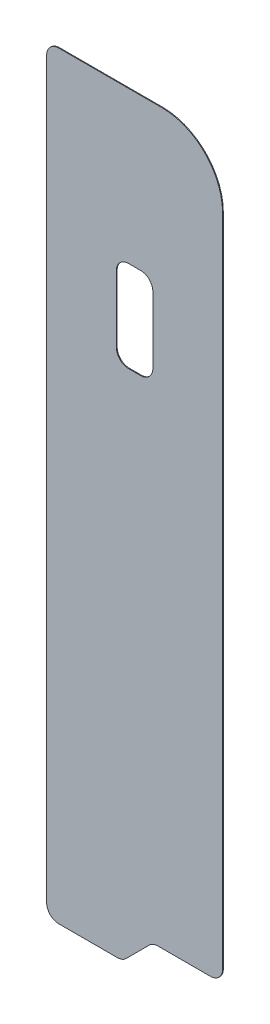
ISO-10303-21;
HEADER;
FILE_DESCRIPTION(('STEP AP214'),'2;1');
FILE_NAME('part.step','',(''),(''),'','','');
FILE_SCHEMA(('AUTOMOTIVE_DESIGN { 1 0 10303 214 1 1 1 1 }'));
ENDSEC;
DATA;
#1=APPLICATION_CONTEXT('core data for automotive mechanical design processes');
#2=APPLICATION_PROTOCOL_DEFINITION('international standard','automotive_design',2000,#1);
#3=PRODUCT_CONTEXT('',#1,'mechanical');
#4=PRODUCT('Part','Part','',(#3));
#5=PRODUCT_RELATED_PRODUCT_CATEGORY('part','',(#4));
#6=PRODUCT_DEFINITION_FORMATION('','',#4);
#7=PRODUCT_DEFINITION_CONTEXT('part definition',#1,'design');
#8=PRODUCT_DEFINITION('design','',#6,#7);
#9=PRODUCT_DEFINITION_SHAPE('','',#8);
#10=(LENGTH_UNIT() NAMED_UNIT(*) SI_UNIT(.MILLI.,.METRE.));
#11=(NAMED_UNIT(*) PLANE_ANGLE_UNIT() SI_UNIT($,.RADIAN.));
#12=(NAMED_UNIT(*) SI_UNIT($,.STERADIAN.) SOLID_ANGLE_UNIT());
#13=UNCERTAINTY_MEASURE_WITH_UNIT(LENGTH_MEASURE(1.E-05),#10,'distance_accuracy_value','');
#14=(GEOMETRIC_REPRESENTATION_CONTEXT(3) GLOBAL_UNCERTAINTY_ASSIGNED_CONTEXT((#13)) GLOBAL_UNIT_ASSIGNED_CONTEXT((#10,
#11,#12)) REPRESENTATION_CONTEXT('',''));
#15=CARTESIAN_POINT('',(0.,0.,0.));
#16=DIRECTION('',(0.,0.,1.));
#17=DIRECTION('',(1.,0.,0.));
#18=AXIS2_PLACEMENT_3D('',#15,#16,#17);
#19=CARTESIAN_POINT('',(-12.5,-60.,0.125));
#20=DIRECTION('',(0.,1.,0.));
#21=DIRECTION('',(-1.,0.,0.));
#22=AXIS2_PLACEMENT_3D('',#19,#20,#21);
#23=PLANE('',#22);
#24=DIRECTION('',(0.,0.,-1.));
#25=VECTOR('',#24,1.);
#26=CARTESIAN_POINT('',(3.82842712474628,-60.,28.0176513619627));
#27=LINE('',#26,#25);
#28=CARTESIAN_POINT('',(3.82842712474628,-60.,0.125));
#29=VERTEX_POINT('',#28);
#30=CARTESIAN_POINT('',(3.82842712474628,-60.,0.));
#31=VERTEX_POINT('',#30);
#32=EDGE_CURVE('E252',#29,#31,#27,.T.);
#33=ORIENTED_EDGE('',*,*,#32,.T.);
#34=DIRECTION('',(1.,0.,0.));
#35=VECTOR('',#34,1.);
#36=CARTESIAN_POINT('',(-12.5,-60.,0.));
#37=LINE('',#36,#35);
#38=CARTESIAN_POINT('',(12.5,-60.,0.));
#39=VERTEX_POINT('',#38);
#40=EDGE_CURVE('E296',#31,#39,#37,.T.);
#41=ORIENTED_EDGE('',*,*,#40,.T.);
#42=DIRECTION('',(0.,0.,-1.));
#43=VECTOR('',#42,1.);
#44=CARTESIAN_POINT('',(12.5,-60.,0.125));
#45=LINE('',#44,#43);
#46=CARTESIAN_POINT('',(12.5,-60.,0.125));
#47=VERTEX_POINT('',#46);
#48=EDGE_CURVE('E308',#47,#39,#45,.T.);
#49=ORIENTED_EDGE('',*,*,#48,.F.);
#50=DIRECTION('',(1.,0.,0.));
#51=VECTOR('',#50,1.);
#52=CARTESIAN_POINT('',(-12.5,-60.,0.125));
#53=LINE('',#52,#51);
#54=EDGE_CURVE('E306',#29,#47,#53,.T.);
#55=ORIENTED_EDGE('',*,*,#54,.F.);
#56=EDGE_LOOP('',(#33,#41,#49,#55));
#57=FACE_BOUND('',#56,.T.);
#58=ADVANCED_FACE('F43',(#57),#23,.F.);
#59=CARTESIAN_POINT('',(12.5,-58.,0.125));
#60=DIRECTION('',(0.,0.,-1.));
#61=DIRECTION('',(-1.,0.,0.));
#62=AXIS2_PLACEMENT_3D('',#59,#60,#61);
#63=CYLINDRICAL_SURFACE('',#62,2.);
#64=CARTESIAN_POINT('',(12.5,-58.,0.));
#65=DIRECTION('',(0.,0.,1.));
#66=DIRECTION('',(1.,0.,0.));
#67=AXIS2_PLACEMENT_3D('',#64,#65,#66);
#68=CIRCLE('',#67,2.);
#69=CARTESIAN_POINT('',(14.5,-58.,0.));
#70=VERTEX_POINT('',#69);
#71=EDGE_CURVE('E286',#39,#70,#68,.T.);
#72=ORIENTED_EDGE('',*,*,#71,.T.);
#73=DIRECTION('',(0.,0.,-1.));
#74=VECTOR('',#73,1.);
#75=CARTESIAN_POINT('',(14.5,-58.,0.125));
#76=LINE('',#75,#74);
#77=CARTESIAN_POINT('',(14.5,-58.,0.125));
#78=VERTEX_POINT('',#77);
#79=EDGE_CURVE('E11',#78,#70,#76,.T.);
#80=ORIENTED_EDGE('',*,*,#79,.F.);
#81=CARTESIAN_POINT('',(12.5,-58.,0.125));
#82=DIRECTION('',(0.,0.,1.));
#83=DIRECTION('',(1.,0.,0.));
#84=AXIS2_PLACEMENT_3D('',#81,#82,#83);
#85=CIRCLE('',#84,2.);
#86=EDGE_CURVE('E292',#47,#78,#85,.T.);
#87=ORIENTED_EDGE('',*,*,#86,.F.);
#88=ORIENTED_EDGE('',*,*,#48,.T.);
#89=EDGE_LOOP('',(#72,#80,#87,#88));
#90=FACE_BOUND('',#89,.T.);
#91=ADVANCED_FACE('F45',(#90),#63,.T.);
#92=CARTESIAN_POINT('',(14.5,50.,0.125));
#93=DIRECTION('',(-1.,0.,0.));
#94=DIRECTION('',(0.,-1.,0.));
#95=AXIS2_PLACEMENT_3D('',#92,#93,#94);
#96=PLANE('',#95);
#97=DIRECTION('',(0.,1.,0.));
#98=VECTOR('',#97,1.);
#99=CARTESIAN_POINT('',(14.5,50.,0.));
#100=LINE('',#99,#98);
#101=CARTESIAN_POINT('',(14.5,50.,0.));
#102=VERTEX_POINT('',#101);
#103=EDGE_CURVE('E311',#70,#102,#100,.T.);
#104=ORIENTED_EDGE('',*,*,#103,.T.);
#105=DIRECTION('',(0.,0.,-1.));
#106=VECTOR('',#105,1.);
#107=CARTESIAN_POINT('',(14.5,50.,0.125));
#108=LINE('',#107,#106);
#109=CARTESIAN_POINT('',(14.5,50.,0.125));
#110=VERTEX_POINT('',#109);
#111=EDGE_CURVE('E51',#110,#102,#108,.T.);
#112=ORIENTED_EDGE('',*,*,#111,.F.);
#113=DIRECTION('',(0.,1.,0.));
#114=VECTOR('',#113,1.);
#115=CARTESIAN_POINT('',(14.5,50.,0.125));
#116=LINE('',#115,#114);
#117=EDGE_CURVE('E295',#78,#110,#116,.T.);
#118=ORIENTED_EDGE('',*,*,#117,.F.);
#119=ORIENTED_EDGE('',*,*,#79,.T.);
#120=EDGE_LOOP('',(#104,#112,#118,#119));
#121=FACE_BOUND('',#120,.T.);
#122=ADVANCED_FACE('F358',(#121),#96,.F.);
#123=CARTESIAN_POINT('',(4.5,50.,0.125));
#124=DIRECTION('',(0.,0.,-1.));
#125=DIRECTION('',(-1.,0.,0.));
#126=AXIS2_PLACEMENT_3D('',#123,#124,#125);
#127=CYLINDRICAL_SURFACE('',#126,10.);
#128=CARTESIAN_POINT('',(4.5,50.,0.));
#129=DIRECTION('',(0.,0.,1.));
#130=DIRECTION('',(-1.,0.,0.));
#131=AXIS2_PLACEMENT_3D('',#128,#129,#130);
#132=CIRCLE('',#131,10.);
#133=CARTESIAN_POINT('',(4.5,60.,0.));
#134=VERTEX_POINT('',#133);
#135=EDGE_CURVE('E313',#102,#134,#132,.T.);
#136=ORIENTED_EDGE('',*,*,#135,.T.);
#137=DIRECTION('',(0.,0.,-1.));
#138=VECTOR('',#137,1.);
#139=CARTESIAN_POINT('',(4.5,60.,0.125));
#140=LINE('',#139,#138);
#141=CARTESIAN_POINT('',(4.5,60.,0.125));
#142=VERTEX_POINT('',#141);
#143=EDGE_CURVE('E330',#142,#134,#140,.T.);
#144=ORIENTED_EDGE('',*,*,#143,.F.);
#145=CARTESIAN_POINT('',(4.5,50.,0.125));
#146=DIRECTION('',(0.,0.,1.));
#147=DIRECTION('',(-1.,0.,0.));
#148=AXIS2_PLACEMENT_3D('',#145,#146,#147);
#149=CIRCLE('',#148,10.);
#150=EDGE_CURVE('E298',#110,#142,#149,.T.);
#151=ORIENTED_EDGE('',*,*,#150,.F.);
#152=ORIENTED_EDGE('',*,*,#111,.T.);
#153=EDGE_LOOP('',(#136,#144,#151,#152));
#154=FACE_BOUND('',#153,.T.);
#155=ADVANCED_FACE('F337',(#154),#127,.T.);
#156=CARTESIAN_POINT('',(-12.5,60.,0.125));
#157=DIRECTION('',(0.,-1.,0.));
#158=DIRECTION('',(1.,0.,0.));
#159=AXIS2_PLACEMENT_3D('',#156,#157,#158);
#160=PLANE('',#159);
#161=DIRECTION('',(-1.,0.,0.));
#162=VECTOR('',#161,1.);
#163=CARTESIAN_POINT('',(-12.5,60.,0.));
#164=LINE('',#163,#162);
#165=CARTESIAN_POINT('',(-12.5,60.,0.));
#166=VERTEX_POINT('',#165);
#167=EDGE_CURVE('E315',#134,#166,#164,.T.);
#168=ORIENTED_EDGE('',*,*,#167,.T.);
#169=DIRECTION('',(0.,0.,-1.));
#170=VECTOR('',#169,1.);
#171=CARTESIAN_POINT('',(-12.5,60.,0.125));
#172=LINE('',#171,#170);
#173=CARTESIAN_POINT('',(-12.5,60.,0.125));
#174=VERTEX_POINT('',#173);
#175=EDGE_CURVE('E327',#174,#166,#172,.T.);
#176=ORIENTED_EDGE('',*,*,#175,.F.);
#177=DIRECTION('',(-1.,0.,0.));
#178=VECTOR('',#177,1.);
#179=CARTESIAN_POINT('',(-12.5,60.,0.125));
#180=LINE('',#179,#178);
#181=EDGE_CURVE('E300',#142,#174,#180,.T.);
#182=ORIENTED_EDGE('',*,*,#181,.F.);
#183=ORIENTED_EDGE('',*,*,#143,.T.);
#184=EDGE_LOOP('',(#168,#176,#182,#183));
#185=FACE_BOUND('',#184,.T.);
#186=ADVANCED_FACE('F346',(#185),#160,.F.);
#187=CARTESIAN_POINT('',(-12.5,58.,0.125));
#188=DIRECTION('',(0.,0.,-1.));
#189=DIRECTION('',(-1.,0.,0.));
#190=AXIS2_PLACEMENT_3D('',#187,#188,#189);
#191=CYLINDRICAL_SURFACE('',#190,2.);
#192=CARTESIAN_POINT('',(-12.5,58.,0.));
#193=DIRECTION('',(0.,0.,1.));
#194=DIRECTION('',(1.,0.,0.));
#195=AXIS2_PLACEMENT_3D('',#192,#193,#194);
#196=CIRCLE('',#195,2.);
#197=CARTESIAN_POINT('',(-14.5,58.,0.));
#198=VERTEX_POINT('',#197);
#199=EDGE_CURVE('E317',#166,#198,#196,.T.);
#200=ORIENTED_EDGE('',*,*,#199,.T.);
#201=DIRECTION('',(0.,0.,-1.));
#202=VECTOR('',#201,1.);
#203=CARTESIAN_POINT('',(-14.5,58.,0.125));
#204=LINE('',#203,#202);
#205=CARTESIAN_POINT('',(-14.5,58.,0.125));
#206=VERTEX_POINT('',#205);
#207=EDGE_CURVE('E324',#206,#198,#204,.T.);
#208=ORIENTED_EDGE('',*,*,#207,.F.);
#209=CARTESIAN_POINT('',(-12.5,58.,0.125));
#210=DIRECTION('',(0.,0.,1.));
#211=DIRECTION('',(1.,0.,0.));
#212=AXIS2_PLACEMENT_3D('',#209,#210,#211);
#213=CIRCLE('',#212,2.);
#214=EDGE_CURVE('E302',#174,#206,#213,.T.);
#215=ORIENTED_EDGE('',*,*,#214,.F.);
#216=ORIENTED_EDGE('',*,*,#175,.T.);
#217=EDGE_LOOP('',(#200,#208,#215,#216));
#218=FACE_BOUND('',#217,.T.);
#219=ADVANCED_FACE('F350',(#218),#191,.T.);
#220=CARTESIAN_POINT('',(-14.5,58.,0.125));
#221=DIRECTION('',(1.,0.,0.));
#222=DIRECTION('',(0.,1.,0.));
#223=AXIS2_PLACEMENT_3D('',#220,#221,#222);
#224=PLANE('',#223);
#225=DIRECTION('',(0.,-1.,0.));
#226=VECTOR('',#225,1.);
#227=CARTESIAN_POINT('',(-14.5,58.,0.));
#228=LINE('',#227,#226);
#229=CARTESIAN_POINT('',(-14.5,-63.0000000000001,0.));
#230=VERTEX_POINT('',#229);
#231=EDGE_CURVE('E319',#198,#230,#228,.T.);
#232=ORIENTED_EDGE('',*,*,#231,.T.);
#233=DIRECTION('',(0.,0.,-1.));
#234=VECTOR('',#233,1.);
#235=CARTESIAN_POINT('',(-14.5,-63.0000000000001,28.0176513619627));
#236=LINE('',#235,#234);
#237=CARTESIAN_POINT('',(-14.5,-63.0000000000001,0.125));
#238=VERTEX_POINT('',#237);
#239=EDGE_CURVE('E267',#238,#230,#236,.T.);
#240=ORIENTED_EDGE('',*,*,#239,.F.);
#241=DIRECTION('',(0.,-1.,0.));
#242=VECTOR('',#241,1.);
#243=CARTESIAN_POINT('',(-14.5,58.,0.125));
#244=LINE('',#243,#242);
#245=EDGE_CURVE('E304',#206,#238,#244,.T.);
#246=ORIENTED_EDGE('',*,*,#245,.F.);
#247=ORIENTED_EDGE('',*,*,#207,.T.);
#248=EDGE_LOOP('',(#232,#240,#246,#247));
#249=FACE_BOUND('',#248,.T.);
#250=ADVANCED_FACE('F385',(#249),#224,.F.);
#251=CARTESIAN_POINT('',(12.5,-58.,0.125));
#252=DIRECTION('',(0.,0.,1.));
#253=DIRECTION('',(1.,0.,0.));
#254=AXIS2_PLACEMENT_3D('',#251,#252,#253);
#255=PLANE('',#254);
#256=CARTESIAN_POINT('',(1.,22.,0.125));
#257=DIRECTION('',(0.,0.,1.));
#258=DIRECTION('',(1.,0.,0.));
#259=AXIS2_PLACEMENT_3D('',#256,#257,#258);
#260=CIRCLE('',#259,2.);
#261=CARTESIAN_POINT('',(1.,20.,0.125));
#262=VERTEX_POINT('',#261);
#263=CARTESIAN_POINT('',(3.,22.,0.125));
#264=VERTEX_POINT('',#263);
#265=EDGE_CURVE('E58',#262,#264,#260,.T.);
#266=ORIENTED_EDGE('',*,*,#265,.F.);
#267=DIRECTION('',(1.,0.,0.));
#268=VECTOR('',#267,1.);
#269=CARTESIAN_POINT('',(-0.999999999999999,20.,0.125));
#270=LINE('',#269,#268);
#271=CARTESIAN_POINT('',(-0.999999999999999,20.,0.125));
#272=VERTEX_POINT('',#271);
#273=EDGE_CURVE('E199',#272,#262,#270,.T.);
#274=ORIENTED_EDGE('',*,*,#273,.F.);
#275=CARTESIAN_POINT('',(-0.999999999999998,22.,0.125));
#276=DIRECTION('',(0.,0.,1.));
#277=DIRECTION('',(1.,0.,0.));
#278=AXIS2_PLACEMENT_3D('',#275,#276,#277);
#279=CIRCLE('',#278,2.);
#280=CARTESIAN_POINT('',(-3.,22.,0.125));
#281=VERTEX_POINT('',#280);
#282=EDGE_CURVE('E202',#281,#272,#279,.T.);
#283=ORIENTED_EDGE('',*,*,#282,.F.);
#284=DIRECTION('',(0.,-1.,0.));
#285=VECTOR('',#284,1.);
#286=CARTESIAN_POINT('',(-3.,32.9999999999978,0.125));
#287=LINE('',#286,#285);
#288=CARTESIAN_POINT('',(-3.,32.9999999999978,0.125));
#289=VERTEX_POINT('',#288);
#290=EDGE_CURVE('E230',#289,#281,#287,.T.);
#291=ORIENTED_EDGE('',*,*,#290,.F.);
#292=CARTESIAN_POINT('',(-1.,32.9999999999978,0.125));
#293=DIRECTION('',(0.,0.,1.));
#294=DIRECTION('',(1.,0.,0.));
#295=AXIS2_PLACEMENT_3D('',#292,#293,#294);
#296=CIRCLE('',#295,2.);
#297=CARTESIAN_POINT('',(-0.999999999999985,34.9999999999978,0.125));
#298=VERTEX_POINT('',#297);
#299=EDGE_CURVE('E227',#298,#289,#296,.T.);
#300=ORIENTED_EDGE('',*,*,#299,.F.);
#301=DIRECTION('',(-1.,0.,0.));
#302=VECTOR('',#301,1.);
#303=CARTESIAN_POINT('',(0.999999999999986,34.9999999999978,0.125));
#304=LINE('',#303,#302);
#305=CARTESIAN_POINT('',(0.999999999999986,34.9999999999978,0.125));
#306=VERTEX_POINT('',#305);
#307=EDGE_CURVE('E224',#306,#298,#304,.T.);
#308=ORIENTED_EDGE('',*,*,#307,.F.);
#309=CARTESIAN_POINT('',(1.,32.9999999999978,0.125));
#310=DIRECTION('',(0.,0.,1.));
#311=DIRECTION('',(1.,0.,0.));
#312=AXIS2_PLACEMENT_3D('',#309,#310,#311);
#313=CIRCLE('',#312,2.);
#314=CARTESIAN_POINT('',(3.,32.9999999999978,0.125));
#315=VERTEX_POINT('',#314);
#316=EDGE_CURVE('E221',#315,#306,#313,.T.);
#317=ORIENTED_EDGE('',*,*,#316,.F.);
#318=DIRECTION('',(0.,1.,0.));
#319=VECTOR('',#318,1.);
#320=CARTESIAN_POINT('',(3.,22.,0.125));
#321=LINE('',#320,#319);
#322=EDGE_CURVE('E219',#264,#315,#321,.T.);
#323=ORIENTED_EDGE('',*,*,#322,.F.);
#324=EDGE_LOOP('',(#266,#274,#283,#291,#300,#308,#317,#323));
#325=FACE_BOUND('',#324,.T.);
#326=ORIENTED_EDGE('',*,*,#54,.T.);
#327=ORIENTED_EDGE('',*,*,#86,.T.);
#328=ORIENTED_EDGE('',*,*,#117,.T.);
#329=ORIENTED_EDGE('',*,*,#150,.T.);
#330=ORIENTED_EDGE('',*,*,#181,.T.);
#331=ORIENTED_EDGE('',*,*,#214,.T.);
#332=ORIENTED_EDGE('',*,*,#245,.T.);
#333=CARTESIAN_POINT('',(-12.5,-63.0000000000001,0.125));
#334=DIRECTION('',(0.,0.,1.));
#335=DIRECTION('',(1.,0.,0.));
#336=AXIS2_PLACEMENT_3D('',#333,#334,#335);
#337=CIRCLE('',#336,2.);
#338=CARTESIAN_POINT('',(-12.5,-65.0000000000001,0.125));
#339=VERTEX_POINT('',#338);
#340=EDGE_CURVE('E264',#339,#238,#337,.F.);
#341=ORIENTED_EDGE('',*,*,#340,.F.);
#342=DIRECTION('',(-1.,0.,0.));
#343=VECTOR('',#342,1.);
#344=CARTESIAN_POINT('',(-12.5,-65.0000000000001,0.125));
#345=LINE('',#344,#343);
#346=CARTESIAN_POINT('',(-2.82842712474608,-65.0000000000001,0.125));
#347=VERTEX_POINT('',#346);
#348=EDGE_CURVE('E269',#347,#339,#345,.T.);
#349=ORIENTED_EDGE('',*,*,#348,.F.);
#350=CARTESIAN_POINT('',(-2.82842712474608,-63.0000000000001,0.125));
#351=DIRECTION('',(0.,0.,1.));
#352=DIRECTION('',(1.,0.,0.));
#353=AXIS2_PLACEMENT_3D('',#350,#351,#352);
#354=CIRCLE('',#353,2.00000000000003);
#355=CARTESIAN_POINT('',(-1.41421356237302,-64.4142135623733,0.125));
#356=VERTEX_POINT('',#355);
#357=EDGE_CURVE('E273',#356,#347,#354,.F.);
#358=ORIENTED_EDGE('',*,*,#357,.F.);
#359=DIRECTION('',(-0.707106781186532,-0.707106781186563,0.));
#360=VECTOR('',#359,1.);
#361=CARTESIAN_POINT('',(-1.41421356237304,-64.4142135623733,0.125));
#362=LINE('',#361,#360);
#363=CARTESIAN_POINT('',(2.41421356237319,-60.5857864376269,0.125));
#364=VERTEX_POINT('',#363);
#365=EDGE_CURVE('E277',#364,#356,#362,.T.);
#366=ORIENTED_EDGE('',*,*,#365,.F.);
#367=CARTESIAN_POINT('',(3.82842712474628,-62.,0.125));
#368=DIRECTION('',(0.,0.,1.));
#369=DIRECTION('',(1.,0.,0.));
#370=AXIS2_PLACEMENT_3D('',#367,#368,#369);
#371=CIRCLE('',#370,1.99999999999999);
#372=EDGE_CURVE('E281',#29,#364,#371,.T.);
#373=ORIENTED_EDGE('',*,*,#372,.F.);
#374=EDGE_LOOP('',(#326,#327,#328,#329,#330,#331,#332,#341,#349,#358,#366,#373));
#375=FACE_BOUND('',#374,.T.);
#376=ADVANCED_FACE('F354',(#325,#375),#255,.T.);
#377=CARTESIAN_POINT('',(12.5,-58.,0.));
#378=DIRECTION('',(0.,0.,1.));
#379=DIRECTION('',(1.,0.,0.));
#380=AXIS2_PLACEMENT_3D('',#377,#378,#379);
#381=PLANE('',#380);
#382=DIRECTION('',(1.,0.,0.));
#383=VECTOR('',#382,1.);
#384=CARTESIAN_POINT('',(-0.999999999999999,20.,0.));
#385=LINE('',#384,#383);
#386=CARTESIAN_POINT('',(-0.999999999999999,20.,0.));
#387=VERTEX_POINT('',#386);
#388=CARTESIAN_POINT('',(1.,20.,0.));
#389=VERTEX_POINT('',#388);
#390=EDGE_CURVE('E188',#387,#389,#385,.T.);
#391=ORIENTED_EDGE('',*,*,#390,.T.);
#392=CARTESIAN_POINT('',(1.,22.,0.));
#393=DIRECTION('',(0.,0.,1.));
#394=DIRECTION('',(1.,0.,0.));
#395=AXIS2_PLACEMENT_3D('',#392,#393,#394);
#396=CIRCLE('',#395,2.);
#397=CARTESIAN_POINT('',(3.,22.,0.));
#398=VERTEX_POINT('',#397);
#399=EDGE_CURVE('E182',#389,#398,#396,.T.);
#400=ORIENTED_EDGE('',*,*,#399,.T.);
#401=DIRECTION('',(0.,1.,0.));
#402=VECTOR('',#401,1.);
#403=CARTESIAN_POINT('',(3.,22.,0.));
#404=LINE('',#403,#402);
#405=CARTESIAN_POINT('',(3.,32.9999999999978,0.));
#406=VERTEX_POINT('',#405);
#407=EDGE_CURVE('E191',#398,#406,#404,.T.);
#408=ORIENTED_EDGE('',*,*,#407,.T.);
#409=CARTESIAN_POINT('',(1.,32.9999999999978,0.));
#410=DIRECTION('',(0.,0.,1.));
#411=DIRECTION('',(1.,0.,0.));
#412=AXIS2_PLACEMENT_3D('',#409,#410,#411);
#413=CIRCLE('',#412,2.);
#414=CARTESIAN_POINT('',(0.999999999999986,34.9999999999978,0.));
#415=VERTEX_POINT('',#414);
#416=EDGE_CURVE('E66',#406,#415,#413,.T.);
#417=ORIENTED_EDGE('',*,*,#416,.T.);
#418=DIRECTION('',(-1.,0.,0.));
#419=VECTOR('',#418,1.);
#420=CARTESIAN_POINT('',(0.999999999999986,34.9999999999978,0.));
#421=LINE('',#420,#419);
#422=CARTESIAN_POINT('',(-0.999999999999985,34.9999999999978,0.));
#423=VERTEX_POINT('',#422);
#424=EDGE_CURVE('E206',#415,#423,#421,.T.);
#425=ORIENTED_EDGE('',*,*,#424,.T.);
#426=CARTESIAN_POINT('',(-1.,32.9999999999978,0.));
#427=DIRECTION('',(0.,0.,1.));
#428=DIRECTION('',(1.,0.,0.));
#429=AXIS2_PLACEMENT_3D('',#426,#427,#428);
#430=CIRCLE('',#429,2.);
#431=CARTESIAN_POINT('',(-3.,32.9999999999978,0.));
#432=VERTEX_POINT('',#431);
#433=EDGE_CURVE('E209',#423,#432,#430,.T.);
#434=ORIENTED_EDGE('',*,*,#433,.T.);
#435=DIRECTION('',(0.,-1.,0.));
#436=VECTOR('',#435,1.);
#437=CARTESIAN_POINT('',(-3.,32.9999999999978,0.));
#438=LINE('',#437,#436);
#439=CARTESIAN_POINT('',(-3.,22.,0.));
#440=VERTEX_POINT('',#439);
#441=EDGE_CURVE('E212',#432,#440,#438,.T.);
#442=ORIENTED_EDGE('',*,*,#441,.T.);
#443=CARTESIAN_POINT('',(-0.999999999999998,22.,0.));
#444=DIRECTION('',(0.,0.,1.));
#445=DIRECTION('',(1.,0.,0.));
#446=AXIS2_PLACEMENT_3D('',#443,#444,#445);
#447=CIRCLE('',#446,2.);
#448=EDGE_CURVE('E215',#440,#387,#447,.T.);
#449=ORIENTED_EDGE('',*,*,#448,.T.);
#450=EDGE_LOOP('',(#391,#400,#408,#417,#425,#434,#442,#449));
#451=FACE_BOUND('',#450,.T.);
#452=ORIENTED_EDGE('',*,*,#71,.F.);
#453=ORIENTED_EDGE('',*,*,#40,.F.);
#454=CARTESIAN_POINT('',(3.82842712474628,-62.,0.));
#455=DIRECTION('',(0.,0.,1.));
#456=DIRECTION('',(-1.,0.,0.));
#457=AXIS2_PLACEMENT_3D('',#454,#455,#456);
#458=CIRCLE('',#457,1.99999999999999);
#459=CARTESIAN_POINT('',(2.41421356237319,-60.5857864376269,0.));
#460=VERTEX_POINT('',#459);
#461=EDGE_CURVE('E237',#31,#460,#458,.T.);
#462=ORIENTED_EDGE('',*,*,#461,.T.);
#463=DIRECTION('',(-0.707106781186532,-0.707106781186563,0.));
#464=VECTOR('',#463,1.);
#465=CARTESIAN_POINT('',(-1.41421356237304,-64.4142135623733,0.));
#466=LINE('',#465,#464);
#467=CARTESIAN_POINT('',(-1.41421356237306,-64.4142135623733,0.));
#468=VERTEX_POINT('',#467);
#469=EDGE_CURVE('E259',#460,#468,#466,.T.);
#470=ORIENTED_EDGE('',*,*,#469,.T.);
#471=CARTESIAN_POINT('',(-2.82842712474608,-63.0000000000001,0.));
#472=DIRECTION('',(0.,0.,-1.));
#473=DIRECTION('',(1.,0.,0.));
#474=AXIS2_PLACEMENT_3D('',#471,#472,#473);
#475=CIRCLE('',#474,2.00000000000003);
#476=CARTESIAN_POINT('',(-2.82842712474608,-65.0000000000001,0.));
#477=VERTEX_POINT('',#476);
#478=EDGE_CURVE('E256',#468,#477,#475,.T.);
#479=ORIENTED_EDGE('',*,*,#478,.T.);
#480=DIRECTION('',(-1.,0.,0.));
#481=VECTOR('',#480,1.);
#482=CARTESIAN_POINT('',(-12.5,-65.0000000000001,0.));
#483=LINE('',#482,#481);
#484=CARTESIAN_POINT('',(-12.5,-65.0000000000001,0.));
#485=VERTEX_POINT('',#484);
#486=EDGE_CURVE('E253',#477,#485,#483,.T.);
#487=ORIENTED_EDGE('',*,*,#486,.T.);
#488=CARTESIAN_POINT('',(-12.5,-63.0000000000001,0.));
#489=DIRECTION('',(0.,0.,-1.));
#490=DIRECTION('',(1.,0.,0.));
#491=AXIS2_PLACEMENT_3D('',#488,#489,#490);
#492=CIRCLE('',#491,2.);
#493=EDGE_CURVE('E249',#485,#230,#492,.T.);
#494=ORIENTED_EDGE('',*,*,#493,.T.);
#495=ORIENTED_EDGE('',*,*,#231,.F.);
#496=ORIENTED_EDGE('',*,*,#199,.F.);
#497=ORIENTED_EDGE('',*,*,#167,.F.);
#498=ORIENTED_EDGE('',*,*,#135,.F.);
#499=ORIENTED_EDGE('',*,*,#103,.F.);
#500=EDGE_LOOP('',(#452,#453,#462,#470,#479,#487,#494,#495,#496,#497,#498,#499));
#501=FACE_BOUND('',#500,.T.);
#502=ADVANCED_FACE('F195',(#451,#501),#381,.F.);
#503=CARTESIAN_POINT('',(3.82842712474628,-62.,28.0176513619627));
#504=DIRECTION('',(0.,0.,-1.));
#505=DIRECTION('',(-1.,0.,0.));
#506=AXIS2_PLACEMENT_3D('',#503,#504,#505);
#507=CYLINDRICAL_SURFACE('',#506,1.99999999999999);
#508=ORIENTED_EDGE('',*,*,#32,.F.);
#509=ORIENTED_EDGE('',*,*,#372,.T.);
#510=DIRECTION('',(0.,0.,-1.));
#511=VECTOR('',#510,1.);
#512=CARTESIAN_POINT('',(2.41421356237319,-60.5857864376269,28.0176513619627));
#513=LINE('',#512,#511);
#514=EDGE_CURVE('E280',#364,#460,#513,.T.);
#515=ORIENTED_EDGE('',*,*,#514,.T.);
#516=ORIENTED_EDGE('',*,*,#461,.F.);
#517=EDGE_LOOP('',(#508,#509,#515,#516));
#518=FACE_BOUND('',#517,.T.);
#519=ADVANCED_FACE('F366',(#518),#507,.F.);
#520=CARTESIAN_POINT('',(-1.41421356237304,-64.4142135623733,28.0176513619627));
#521=DIRECTION('',(0.707106781186563,-0.707106781186532,0.));
#522=DIRECTION('',(0.707106781186532,0.707106781186563,0.));
#523=AXIS2_PLACEMENT_3D('',#520,#521,#522);
#524=PLANE('',#523);
#525=ORIENTED_EDGE('',*,*,#514,.F.);
#526=ORIENTED_EDGE('',*,*,#365,.T.);
#527=DIRECTION('',(0.,0.,-1.));
#528=VECTOR('',#527,1.);
#529=CARTESIAN_POINT('',(-1.41421356237306,-64.4142135623733,28.0176513619627));
#530=LINE('',#529,#528);
#531=EDGE_CURVE('E276',#356,#468,#530,.T.);
#532=ORIENTED_EDGE('',*,*,#531,.T.);
#533=ORIENTED_EDGE('',*,*,#469,.F.);
#534=EDGE_LOOP('',(#525,#526,#532,#533));
#535=FACE_BOUND('',#534,.T.);
#536=ADVANCED_FACE('F371',(#535),#524,.T.);
#537=CARTESIAN_POINT('',(-2.82842712474608,-63.0000000000001,28.0176513619627));
#538=DIRECTION('',(0.,0.,-1.));
#539=DIRECTION('',(-1.,0.,0.));
#540=AXIS2_PLACEMENT_3D('',#537,#538,#539);
#541=CYLINDRICAL_SURFACE('',#540,2.00000000000003);
#542=ORIENTED_EDGE('',*,*,#531,.F.);
#543=ORIENTED_EDGE('',*,*,#357,.T.);
#544=DIRECTION('',(0.,0.,-1.));
#545=VECTOR('',#544,1.);
#546=CARTESIAN_POINT('',(-2.82842712474608,-65.0000000000001,28.0176513619627));
#547=LINE('',#546,#545);
#548=EDGE_CURVE('E272',#347,#477,#547,.T.);
#549=ORIENTED_EDGE('',*,*,#548,.T.);
#550=ORIENTED_EDGE('',*,*,#478,.F.);
#551=EDGE_LOOP('',(#542,#543,#549,#550));
#552=FACE_BOUND('',#551,.T.);
#553=ADVANCED_FACE('F376',(#552),#541,.T.);
#554=CARTESIAN_POINT('',(-12.5,-65.0000000000001,28.0176513619627));
#555=DIRECTION('',(0.,-1.,0.));
#556=DIRECTION('',(0.,0.,-1.));
#557=AXIS2_PLACEMENT_3D('',#554,#555,#556);
#558=PLANE('',#557);
#559=ORIENTED_EDGE('',*,*,#548,.F.);
#560=ORIENTED_EDGE('',*,*,#348,.T.);
#561=DIRECTION('',(0.,0.,-1.));
#562=VECTOR('',#561,1.);
#563=CARTESIAN_POINT('',(-12.5,-65.0000000000001,28.0176513619627));
#564=LINE('',#563,#562);
#565=EDGE_CURVE('E268',#339,#485,#564,.T.);
#566=ORIENTED_EDGE('',*,*,#565,.T.);
#567=ORIENTED_EDGE('',*,*,#486,.F.);
#568=EDGE_LOOP('',(#559,#560,#566,#567));
#569=FACE_BOUND('',#568,.T.);
#570=ADVANCED_FACE('F379',(#569),#558,.T.);
#571=CARTESIAN_POINT('',(-12.5,-63.0000000000001,28.0176513619627));
#572=DIRECTION('',(0.,0.,-1.));
#573=DIRECTION('',(-1.,0.,0.));
#574=AXIS2_PLACEMENT_3D('',#571,#572,#573);
#575=CYLINDRICAL_SURFACE('',#574,2.);
#576=ORIENTED_EDGE('',*,*,#565,.F.);
#577=ORIENTED_EDGE('',*,*,#340,.T.);
#578=ORIENTED_EDGE('',*,*,#239,.T.);
#579=ORIENTED_EDGE('',*,*,#493,.F.);
#580=EDGE_LOOP('',(#576,#577,#578,#579));
#581=FACE_BOUND('',#580,.T.);
#582=ADVANCED_FACE('F383',(#581),#575,.T.);
#583=CARTESIAN_POINT('',(1.,22.,0.));
#584=DIRECTION('',(0.,0.,1.));
#585=DIRECTION('',(1.,0.,0.));
#586=AXIS2_PLACEMENT_3D('',#583,#584,#585);
#587=CYLINDRICAL_SURFACE('',#586,2.);
#588=ORIENTED_EDGE('',*,*,#265,.T.);
#589=DIRECTION('',(0.,0.,1.));
#590=VECTOR('',#589,1.);
#591=CARTESIAN_POINT('',(3.,22.,0.));
#592=LINE('',#591,#590);
#593=EDGE_CURVE('E178',#398,#264,#592,.T.);
#594=ORIENTED_EDGE('',*,*,#593,.F.);
#595=ORIENTED_EDGE('',*,*,#399,.F.);
#596=DIRECTION('',(0.,0.,1.));
#597=VECTOR('',#596,1.);
#598=CARTESIAN_POINT('',(1.,20.,0.));
#599=LINE('',#598,#597);
#600=EDGE_CURVE('E235',#389,#262,#599,.T.);
#601=ORIENTED_EDGE('',*,*,#600,.T.);
#602=EDGE_LOOP('',(#588,#594,#595,#601));
#603=FACE_BOUND('',#602,.T.);
#604=ADVANCED_FACE('F180',(#603),#587,.F.);
#605=CARTESIAN_POINT('',(-0.999999999999999,20.,0.));
#606=DIRECTION('',(0.,-1.,0.));
#607=DIRECTION('',(0.,0.,-1.));
#608=AXIS2_PLACEMENT_3D('',#605,#606,#607);
#609=PLANE('',#608);
#610=ORIENTED_EDGE('',*,*,#273,.T.);
#611=ORIENTED_EDGE('',*,*,#600,.F.);
#612=ORIENTED_EDGE('',*,*,#390,.F.);
#613=DIRECTION('',(0.,0.,1.));
#614=VECTOR('',#613,1.);
#615=CARTESIAN_POINT('',(-0.999999999999999,20.,0.));
#616=LINE('',#615,#614);
#617=EDGE_CURVE('E238',#387,#272,#616,.T.);
#618=ORIENTED_EDGE('',*,*,#617,.T.);
#619=EDGE_LOOP('',(#610,#611,#612,#618));
#620=FACE_BOUND('',#619,.T.);
#621=ADVANCED_FACE('F496',(#620),#609,.F.);
#622=CARTESIAN_POINT('',(-0.999999999999998,22.,0.));
#623=DIRECTION('',(0.,0.,1.));
#624=DIRECTION('',(1.,0.,0.));
#625=AXIS2_PLACEMENT_3D('',#622,#623,#624);
#626=CYLINDRICAL_SURFACE('',#625,2.);
#627=ORIENTED_EDGE('',*,*,#282,.T.);
#628=ORIENTED_EDGE('',*,*,#617,.F.);
#629=ORIENTED_EDGE('',*,*,#448,.F.);
#630=DIRECTION('',(0.,0.,1.));
#631=VECTOR('',#630,1.);
#632=CARTESIAN_POINT('',(-3.,22.,0.));
#633=LINE('',#632,#631);
#634=EDGE_CURVE('E240',#440,#281,#633,.T.);
#635=ORIENTED_EDGE('',*,*,#634,.T.);
#636=EDGE_LOOP('',(#627,#628,#629,#635));
#637=FACE_BOUND('',#636,.T.);
#638=ADVANCED_FACE('F504',(#637),#626,.F.);
#639=CARTESIAN_POINT('',(-3.,32.9999999999978,0.));
#640=DIRECTION('',(-1.,0.,0.));
#641=DIRECTION('',(0.,-1.,0.));
#642=AXIS2_PLACEMENT_3D('',#639,#640,#641);
#643=PLANE('',#642);
#644=ORIENTED_EDGE('',*,*,#290,.T.);
#645=ORIENTED_EDGE('',*,*,#634,.F.);
#646=ORIENTED_EDGE('',*,*,#441,.F.);
#647=DIRECTION('',(0.,0.,1.));
#648=VECTOR('',#647,1.);
#649=CARTESIAN_POINT('',(-3.,32.9999999999978,0.));
#650=LINE('',#649,#648);
#651=EDGE_CURVE('E242',#432,#289,#650,.T.);
#652=ORIENTED_EDGE('',*,*,#651,.T.);
#653=EDGE_LOOP('',(#644,#645,#646,#652));
#654=FACE_BOUND('',#653,.T.);
#655=ADVANCED_FACE('F513',(#654),#643,.F.);
#656=CARTESIAN_POINT('',(-1.,32.9999999999978,0.));
#657=DIRECTION('',(0.,0.,1.));
#658=DIRECTION('',(1.,0.,0.));
#659=AXIS2_PLACEMENT_3D('',#656,#657,#658);
#660=CYLINDRICAL_SURFACE('',#659,2.);
#661=ORIENTED_EDGE('',*,*,#299,.T.);
#662=ORIENTED_EDGE('',*,*,#651,.F.);
#663=ORIENTED_EDGE('',*,*,#433,.F.);
#664=DIRECTION('',(0.,0.,1.));
#665=VECTOR('',#664,1.);
#666=CARTESIAN_POINT('',(-0.999999999999985,34.9999999999978,0.));
#667=LINE('',#666,#665);
#668=EDGE_CURVE('E244',#423,#298,#667,.T.);
#669=ORIENTED_EDGE('',*,*,#668,.T.);
#670=EDGE_LOOP('',(#661,#662,#663,#669));
#671=FACE_BOUND('',#670,.T.);
#672=ADVANCED_FACE('F522',(#671),#660,.F.);
#673=CARTESIAN_POINT('',(0.999999999999986,34.9999999999978,0.));
#674=DIRECTION('',(0.,1.,0.));
#675=DIRECTION('',(0.,0.,1.));
#676=AXIS2_PLACEMENT_3D('',#673,#674,#675);
#677=PLANE('',#676);
#678=ORIENTED_EDGE('',*,*,#307,.T.);
#679=ORIENTED_EDGE('',*,*,#668,.F.);
#680=ORIENTED_EDGE('',*,*,#424,.F.);
#681=DIRECTION('',(0.,0.,1.));
#682=VECTOR('',#681,1.);
#683=CARTESIAN_POINT('',(0.999999999999986,34.9999999999978,0.));
#684=LINE('',#683,#682);
#685=EDGE_CURVE('E246',#415,#306,#684,.T.);
#686=ORIENTED_EDGE('',*,*,#685,.T.);
#687=EDGE_LOOP('',(#678,#679,#680,#686));
#688=FACE_BOUND('',#687,.T.);
#689=ADVANCED_FACE('F531',(#688),#677,.F.);
#690=CARTESIAN_POINT('',(1.,32.9999999999978,0.));
#691=DIRECTION('',(0.,0.,1.));
#692=DIRECTION('',(1.,0.,0.));
#693=AXIS2_PLACEMENT_3D('',#690,#691,#692);
#694=CYLINDRICAL_SURFACE('',#693,2.);
#695=ORIENTED_EDGE('',*,*,#316,.T.);
#696=ORIENTED_EDGE('',*,*,#685,.F.);
#697=ORIENTED_EDGE('',*,*,#416,.F.);
#698=DIRECTION('',(0.,0.,1.));
#699=VECTOR('',#698,1.);
#700=CARTESIAN_POINT('',(3.,32.9999999999978,0.));
#701=LINE('',#700,#699);
#702=EDGE_CURVE('E187',#406,#315,#701,.T.);
#703=ORIENTED_EDGE('',*,*,#702,.T.);
#704=EDGE_LOOP('',(#695,#696,#697,#703));
#705=FACE_BOUND('',#704,.T.);
#706=ADVANCED_FACE('F540',(#705),#694,.F.);
#707=CARTESIAN_POINT('',(3.,22.,0.));
#708=DIRECTION('',(1.,0.,0.));
#709=DIRECTION('',(0.,1.,0.));
#710=AXIS2_PLACEMENT_3D('',#707,#708,#709);
#711=PLANE('',#710);
#712=ORIENTED_EDGE('',*,*,#322,.T.);
#713=ORIENTED_EDGE('',*,*,#702,.F.);
#714=ORIENTED_EDGE('',*,*,#407,.F.);
#715=ORIENTED_EDGE('',*,*,#593,.T.);
#716=EDGE_LOOP('',(#712,#713,#714,#715));
#717=FACE_BOUND('',#716,.T.);
#718=ADVANCED_FACE('F192',(#717),#711,.F.);
#719=CLOSED_SHELL('',(#58,#91,#122,#155,#186,#219,#250,#376,#502,#519,#536,#553,#570,#582,#604,
#621,#638,#655,#672,#689,#706,#718));
#720=MANIFOLD_SOLID_BREP('B2',#719);
#721=ADVANCED_BREP_SHAPE_REPRESENTATION('',(#18,#720),#14);
#722=SHAPE_DEFINITION_REPRESENTATION(#9,#721);
ENDSEC;
END-ISO-10303-21;
